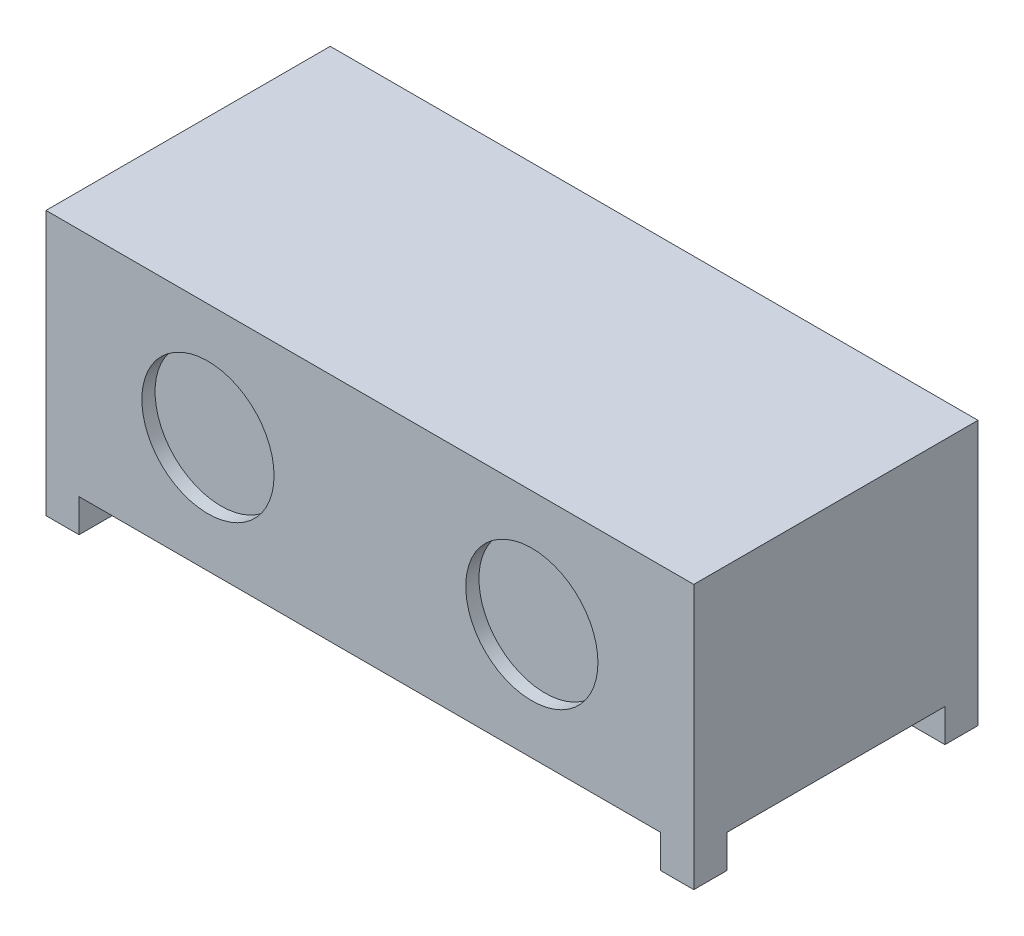
ISO-10303-21;
HEADER;
FILE_DESCRIPTION(('STEP AP214'),'2;1');
FILE_NAME('part.step','',(''),(''),'','','');
FILE_SCHEMA(('AUTOMOTIVE_DESIGN { 1 0 10303 214 1 1 1 1 }'));
ENDSEC;
DATA;
#1=APPLICATION_CONTEXT('core data for automotive mechanical design processes');
#2=APPLICATION_PROTOCOL_DEFINITION('international standard','automotive_design',2000,#1);
#3=PRODUCT_CONTEXT('',#1,'mechanical');
#4=PRODUCT('Part','Part','',(#3));
#5=PRODUCT_RELATED_PRODUCT_CATEGORY('part','',(#4));
#6=PRODUCT_DEFINITION_FORMATION('','',#4);
#7=PRODUCT_DEFINITION_CONTEXT('part definition',#1,'design');
#8=PRODUCT_DEFINITION('design','',#6,#7);
#9=PRODUCT_DEFINITION_SHAPE('','',#8);
#10=(LENGTH_UNIT() NAMED_UNIT(*) SI_UNIT(.MILLI.,.METRE.));
#11=(NAMED_UNIT(*) PLANE_ANGLE_UNIT() SI_UNIT($,.RADIAN.));
#12=(NAMED_UNIT(*) SI_UNIT($,.STERADIAN.) SOLID_ANGLE_UNIT());
#13=UNCERTAINTY_MEASURE_WITH_UNIT(LENGTH_MEASURE(1.E-05),#10,'distance_accuracy_value','');
#14=(GEOMETRIC_REPRESENTATION_CONTEXT(3) GLOBAL_UNCERTAINTY_ASSIGNED_CONTEXT((#13)) GLOBAL_UNIT_ASSIGNED_CONTEXT((#10,
#11,#12)) REPRESENTATION_CONTEXT('',''));
#15=CARTESIAN_POINT('',(0.,0.,0.));
#16=DIRECTION('',(0.,0.,1.));
#17=DIRECTION('',(1.,0.,0.));
#18=AXIS2_PLACEMENT_3D('',#15,#16,#17);
#19=CARTESIAN_POINT('',(0.,0.,0.));
#20=DIRECTION('',(0.,1.,0.));
#21=DIRECTION('',(0.,0.,1.));
#22=AXIS2_PLACEMENT_3D('',#19,#20,#21);
#23=PLANE('',#22);
#24=DIRECTION('',(-1.,0.,0.));
#25=VECTOR('',#24,1.);
#26=CARTESIAN_POINT('',(1244.6,0.,-419.1));
#27=LINE('',#26,#25);
#28=CARTESIAN_POINT('',(1244.6,0.,-419.1));
#29=VERTEX_POINT('',#28);
#30=CARTESIAN_POINT('',(1117.6,0.,-419.1));
#31=VERTEX_POINT('',#30);
#32=EDGE_CURVE('E323',#29,#31,#27,.T.);
#33=ORIENTED_EDGE('',*,*,#32,.F.);
#34=DIRECTION('',(0.,0.,-1.));
#35=VECTOR('',#34,1.);
#36=CARTESIAN_POINT('',(1244.6,0.,-546.1));
#37=LINE('',#36,#35);
#38=CARTESIAN_POINT('',(1244.6,0.,419.1));
#39=VERTEX_POINT('',#38);
#40=EDGE_CURVE('E171',#39,#29,#37,.T.);
#41=ORIENTED_EDGE('',*,*,#40,.F.);
#42=DIRECTION('',(1.,0.,0.));
#43=VECTOR('',#42,1.);
#44=CARTESIAN_POINT('',(1244.6,0.,419.1));
#45=LINE('',#44,#43);
#46=CARTESIAN_POINT('',(1117.6,0.,419.1));
#47=VERTEX_POINT('',#46);
#48=EDGE_CURVE('E174',#47,#39,#45,.T.);
#49=ORIENTED_EDGE('',*,*,#48,.F.);
#50=DIRECTION('',(0.,0.,-1.));
#51=VECTOR('',#50,1.);
#52=CARTESIAN_POINT('',(1117.6,0.,546.1));
#53=LINE('',#52,#51);
#54=CARTESIAN_POINT('',(1117.6,0.,546.1));
#55=VERTEX_POINT('',#54);
#56=EDGE_CURVE('E172',#55,#47,#53,.T.);
#57=ORIENTED_EDGE('',*,*,#56,.F.);
#58=DIRECTION('',(1.,0.,0.));
#59=VECTOR('',#58,1.);
#60=CARTESIAN_POINT('',(-1244.6,0.,546.1));
#61=LINE('',#60,#59);
#62=CARTESIAN_POINT('',(-1117.6,0.,546.1));
#63=VERTEX_POINT('',#62);
#64=EDGE_CURVE('E257',#63,#55,#61,.T.);
#65=ORIENTED_EDGE('',*,*,#64,.F.);
#66=DIRECTION('',(0.,0.,1.));
#67=VECTOR('',#66,1.);
#68=CARTESIAN_POINT('',(-1117.6,0.,546.1));
#69=LINE('',#68,#67);
#70=CARTESIAN_POINT('',(-1117.6,0.,419.1));
#71=VERTEX_POINT('',#70);
#72=EDGE_CURVE('E221',#71,#63,#69,.T.);
#73=ORIENTED_EDGE('',*,*,#72,.F.);
#74=DIRECTION('',(1.,0.,0.));
#75=VECTOR('',#74,1.);
#76=CARTESIAN_POINT('',(-1244.6,0.,419.1));
#77=LINE('',#76,#75);
#78=CARTESIAN_POINT('',(-1244.6,0.,419.1));
#79=VERTEX_POINT('',#78);
#80=EDGE_CURVE('E216',#79,#71,#77,.T.);
#81=ORIENTED_EDGE('',*,*,#80,.F.);
#82=DIRECTION('',(0.,0.,1.));
#83=VECTOR('',#82,1.);
#84=CARTESIAN_POINT('',(-1244.6,0.,-546.1));
#85=LINE('',#84,#83);
#86=CARTESIAN_POINT('',(-1244.6,0.,-419.1));
#87=VERTEX_POINT('',#86);
#88=EDGE_CURVE('E267',#87,#79,#85,.T.);
#89=ORIENTED_EDGE('',*,*,#88,.F.);
#90=DIRECTION('',(-1.,0.,0.));
#91=VECTOR('',#90,1.);
#92=CARTESIAN_POINT('',(-1244.6,0.,-419.1));
#93=LINE('',#92,#91);
#94=CARTESIAN_POINT('',(-1117.6,0.,-419.1));
#95=VERTEX_POINT('',#94);
#96=EDGE_CURVE('E201',#95,#87,#93,.T.);
#97=ORIENTED_EDGE('',*,*,#96,.F.);
#98=DIRECTION('',(0.,0.,1.));
#99=VECTOR('',#98,1.);
#100=CARTESIAN_POINT('',(-1117.6,0.,-546.1));
#101=LINE('',#100,#99);
#102=CARTESIAN_POINT('',(-1117.6,0.,-546.1));
#103=VERTEX_POINT('',#102);
#104=EDGE_CURVE('E196',#103,#95,#101,.T.);
#105=ORIENTED_EDGE('',*,*,#104,.F.);
#106=DIRECTION('',(-1.,0.,0.));
#107=VECTOR('',#106,1.);
#108=CARTESIAN_POINT('',(-1244.6,0.,-546.1));
#109=LINE('',#108,#107);
#110=CARTESIAN_POINT('',(1117.6,0.,-546.1));
#111=VERTEX_POINT('',#110);
#112=EDGE_CURVE('E265',#111,#103,#109,.T.);
#113=ORIENTED_EDGE('',*,*,#112,.F.);
#114=DIRECTION('',(0.,0.,-1.));
#115=VECTOR('',#114,1.);
#116=CARTESIAN_POINT('',(1117.6,0.,-546.1));
#117=LINE('',#116,#115);
#118=EDGE_CURVE('E166',#31,#111,#117,.T.);
#119=ORIENTED_EDGE('',*,*,#118,.F.);
#120=EDGE_LOOP('',(#33,#41,#49,#57,#65,#73,#81,#89,#97,#105,#113,#119));
#121=FACE_BOUND('',#120,.T.);
#122=ADVANCED_FACE('F34',(#121),#23,.F.);
#123=CARTESIAN_POINT('',(1244.6,889.,-546.1));
#124=DIRECTION('',(-1.,0.,0.));
#125=DIRECTION('',(0.,0.,1.));
#126=AXIS2_PLACEMENT_3D('',#123,#124,#125);
#127=PLANE('',#126);
#128=DIRECTION('',(0.,-1.,0.));
#129=VECTOR('',#128,1.);
#130=CARTESIAN_POINT('',(1244.6,889.,546.1));
#131=LINE('',#130,#129);
#132=CARTESIAN_POINT('',(1244.6,889.,546.1));
#133=VERTEX_POINT('',#132);
#134=CARTESIAN_POINT('',(1244.6,-127.,546.1));
#135=VERTEX_POINT('',#134);
#136=EDGE_CURVE('E263',#133,#135,#131,.T.);
#137=ORIENTED_EDGE('',*,*,#136,.T.);
#138=DIRECTION('',(0.,0.,1.));
#139=VECTOR('',#138,1.);
#140=CARTESIAN_POINT('',(1244.6,-127.,546.1));
#141=LINE('',#140,#139);
#142=CARTESIAN_POINT('',(1244.6,-127.,419.1));
#143=VERTEX_POINT('',#142);
#144=EDGE_CURVE('E179',#143,#135,#141,.T.);
#145=ORIENTED_EDGE('',*,*,#144,.F.);
#146=DIRECTION('',(0.,1.,0.));
#147=VECTOR('',#146,1.);
#148=CARTESIAN_POINT('',(1244.6,-127.,419.1));
#149=LINE('',#148,#147);
#150=EDGE_CURVE('E187',#143,#39,#149,.T.);
#151=ORIENTED_EDGE('',*,*,#150,.T.);
#152=ORIENTED_EDGE('',*,*,#40,.T.);
#153=DIRECTION('',(0.,1.,0.));
#154=VECTOR('',#153,1.);
#155=CARTESIAN_POINT('',(1244.6,-127.,-419.1));
#156=LINE('',#155,#154);
#157=CARTESIAN_POINT('',(1244.6,-127.,-419.1));
#158=VERTEX_POINT('',#157);
#159=EDGE_CURVE('E151',#158,#29,#156,.T.);
#160=ORIENTED_EDGE('',*,*,#159,.F.);
#161=DIRECTION('',(0.,0.,1.));
#162=VECTOR('',#161,1.);
#163=CARTESIAN_POINT('',(1244.6,-127.,-546.1));
#164=LINE('',#163,#162);
#165=CARTESIAN_POINT('',(1244.6,-127.,-546.1));
#166=VERTEX_POINT('',#165);
#167=EDGE_CURVE('E158',#166,#158,#164,.T.);
#168=ORIENTED_EDGE('',*,*,#167,.F.);
#169=DIRECTION('',(0.,-1.,0.));
#170=VECTOR('',#169,1.);
#171=CARTESIAN_POINT('',(1244.6,889.,-546.1));
#172=LINE('',#171,#170);
#173=CARTESIAN_POINT('',(1244.6,889.,-546.1));
#174=VERTEX_POINT('',#173);
#175=EDGE_CURVE('E11',#174,#166,#172,.T.);
#176=ORIENTED_EDGE('',*,*,#175,.F.);
#177=DIRECTION('',(0.,0.,-1.));
#178=VECTOR('',#177,1.);
#179=CARTESIAN_POINT('',(1244.6,889.,-546.1));
#180=LINE('',#179,#178);
#181=EDGE_CURVE('E253',#133,#174,#180,.T.);
#182=ORIENTED_EDGE('',*,*,#181,.F.);
#183=EDGE_LOOP('',(#137,#145,#151,#152,#160,#168,#176,#182));
#184=FACE_BOUND('',#183,.T.);
#185=ADVANCED_FACE('F36',(#184),#127,.F.);
#186=CARTESIAN_POINT('',(-1244.6,889.,-546.1));
#187=DIRECTION('',(0.,0.,1.));
#188=DIRECTION('',(1.,0.,0.));
#189=AXIS2_PLACEMENT_3D('',#186,#187,#188);
#190=PLANE('',#189);
#191=ORIENTED_EDGE('',*,*,#175,.T.);
#192=DIRECTION('',(1.,0.,0.));
#193=VECTOR('',#192,1.);
#194=CARTESIAN_POINT('',(1244.6,-127.,-546.1));
#195=LINE('',#194,#193);
#196=CARTESIAN_POINT('',(1117.6,-127.,-546.1));
#197=VERTEX_POINT('',#196);
#198=EDGE_CURVE('E163',#197,#166,#195,.T.);
#199=ORIENTED_EDGE('',*,*,#198,.F.);
#200=DIRECTION('',(0.,1.,0.));
#201=VECTOR('',#200,1.);
#202=CARTESIAN_POINT('',(1117.6,-127.,-546.1));
#203=LINE('',#202,#201);
#204=EDGE_CURVE('E49',#197,#111,#203,.T.);
#205=ORIENTED_EDGE('',*,*,#204,.T.);
#206=ORIENTED_EDGE('',*,*,#112,.T.);
#207=DIRECTION('',(0.,1.,0.));
#208=VECTOR('',#207,1.);
#209=CARTESIAN_POINT('',(-1117.6,-127.,-546.1));
#210=LINE('',#209,#208);
#211=CARTESIAN_POINT('',(-1117.6,-127.,-546.1));
#212=VERTEX_POINT('',#211);
#213=EDGE_CURVE('E213',#212,#103,#210,.T.);
#214=ORIENTED_EDGE('',*,*,#213,.F.);
#215=DIRECTION('',(1.,0.,0.));
#216=VECTOR('',#215,1.);
#217=CARTESIAN_POINT('',(-1244.6,-127.,-546.1));
#218=LINE('',#217,#216);
#219=CARTESIAN_POINT('',(-1244.6,-127.,-546.1));
#220=VERTEX_POINT('',#219);
#221=EDGE_CURVE('E200',#220,#212,#218,.T.);
#222=ORIENTED_EDGE('',*,*,#221,.F.);
#223=DIRECTION('',(0.,-1.,0.));
#224=VECTOR('',#223,1.);
#225=CARTESIAN_POINT('',(-1244.6,889.,-546.1));
#226=LINE('',#225,#224);
#227=CARTESIAN_POINT('',(-1244.6,889.,-546.1));
#228=VERTEX_POINT('',#227);
#229=EDGE_CURVE('E42',#228,#220,#226,.T.);
#230=ORIENTED_EDGE('',*,*,#229,.F.);
#231=DIRECTION('',(-1.,0.,0.));
#232=VECTOR('',#231,1.);
#233=CARTESIAN_POINT('',(-1244.6,889.,-546.1));
#234=LINE('',#233,#232);
#235=EDGE_CURVE('E256',#174,#228,#234,.T.);
#236=ORIENTED_EDGE('',*,*,#235,.F.);
#237=EDGE_LOOP('',(#191,#199,#205,#206,#214,#222,#230,#236));
#238=FACE_BOUND('',#237,.T.);
#239=ADVANCED_FACE('F279',(#238),#190,.F.);
#240=CARTESIAN_POINT('',(-1244.6,889.,-546.1));
#241=DIRECTION('',(1.,0.,0.));
#242=DIRECTION('',(0.,0.,-1.));
#243=AXIS2_PLACEMENT_3D('',#240,#241,#242);
#244=PLANE('',#243);
#245=ORIENTED_EDGE('',*,*,#229,.T.);
#246=DIRECTION('',(0.,0.,-1.));
#247=VECTOR('',#246,1.);
#248=CARTESIAN_POINT('',(-1244.6,-127.,-546.1));
#249=LINE('',#248,#247);
#250=CARTESIAN_POINT('',(-1244.6,-127.,-419.1));
#251=VERTEX_POINT('',#250);
#252=EDGE_CURVE('E197',#251,#220,#249,.T.);
#253=ORIENTED_EDGE('',*,*,#252,.F.);
#254=DIRECTION('',(0.,1.,0.));
#255=VECTOR('',#254,1.);
#256=CARTESIAN_POINT('',(-1244.6,-127.,-419.1));
#257=LINE('',#256,#255);
#258=EDGE_CURVE('E57',#251,#87,#257,.T.);
#259=ORIENTED_EDGE('',*,*,#258,.T.);
#260=ORIENTED_EDGE('',*,*,#88,.T.);
#261=DIRECTION('',(0.,1.,0.));
#262=VECTOR('',#261,1.);
#263=CARTESIAN_POINT('',(-1244.6,-127.,419.1));
#264=LINE('',#263,#262);
#265=CARTESIAN_POINT('',(-1244.6,-127.,419.1));
#266=VERTEX_POINT('',#265);
#267=EDGE_CURVE('E238',#266,#79,#264,.T.);
#268=ORIENTED_EDGE('',*,*,#267,.F.);
#269=DIRECTION('',(0.,0.,-1.));
#270=VECTOR('',#269,1.);
#271=CARTESIAN_POINT('',(-1244.6,-127.,546.1));
#272=LINE('',#271,#270);
#273=CARTESIAN_POINT('',(-1244.6,-127.,546.1));
#274=VERTEX_POINT('',#273);
#275=EDGE_CURVE('E217',#274,#266,#272,.T.);
#276=ORIENTED_EDGE('',*,*,#275,.F.);
#277=DIRECTION('',(0.,-1.,0.));
#278=VECTOR('',#277,1.);
#279=CARTESIAN_POINT('',(-1244.6,889.,546.1));
#280=LINE('',#279,#278);
#281=CARTESIAN_POINT('',(-1244.6,889.,546.1));
#282=VERTEX_POINT('',#281);
#283=EDGE_CURVE('E272',#282,#274,#280,.T.);
#284=ORIENTED_EDGE('',*,*,#283,.F.);
#285=DIRECTION('',(0.,0.,1.));
#286=VECTOR('',#285,1.);
#287=CARTESIAN_POINT('',(-1244.6,889.,-546.1));
#288=LINE('',#287,#286);
#289=EDGE_CURVE('E259',#228,#282,#288,.T.);
#290=ORIENTED_EDGE('',*,*,#289,.F.);
#291=EDGE_LOOP('',(#245,#253,#259,#260,#268,#276,#284,#290));
#292=FACE_BOUND('',#291,.T.);
#293=ADVANCED_FACE('F276',(#292),#244,.F.);
#294=CARTESIAN_POINT('',(-1244.6,889.,546.1));
#295=DIRECTION('',(0.,0.,-1.));
#296=DIRECTION('',(-1.,0.,0.));
#297=AXIS2_PLACEMENT_3D('',#294,#295,#296);
#298=PLANE('',#297);
#299=CARTESIAN_POINT('',(622.3,444.5,546.1));
#300=DIRECTION('',(0.,0.,1.));
#301=DIRECTION('',(1.,0.,0.));
#302=AXIS2_PLACEMENT_3D('',#299,#300,#301);
#303=CIRCLE('',#302,254.);
#304=CARTESIAN_POINT('',(876.3,444.5,546.1));
#305=VERTEX_POINT('',#304);
#306=EDGE_CURVE('E245',#305,#305,#303,.T.);
#307=ORIENTED_EDGE('',*,*,#306,.F.);
#308=EDGE_LOOP('',(#307));
#309=FACE_BOUND('',#308,.T.);
#310=CARTESIAN_POINT('',(-622.3,444.5,546.1));
#311=DIRECTION('',(0.,0.,1.));
#312=DIRECTION('',(1.,0.,0.));
#313=AXIS2_PLACEMENT_3D('',#310,#311,#312);
#314=CIRCLE('',#313,254.);
#315=CARTESIAN_POINT('',(-368.3,444.5,546.1));
#316=VERTEX_POINT('',#315);
#317=EDGE_CURVE('E241',#316,#316,#314,.T.);
#318=ORIENTED_EDGE('',*,*,#317,.F.);
#319=EDGE_LOOP('',(#318));
#320=FACE_BOUND('',#319,.T.);
#321=ORIENTED_EDGE('',*,*,#283,.T.);
#322=DIRECTION('',(-1.,0.,0.));
#323=VECTOR('',#322,1.);
#324=CARTESIAN_POINT('',(-1244.6,-127.,546.1));
#325=LINE('',#324,#323);
#326=CARTESIAN_POINT('',(-1117.6,-127.,546.1));
#327=VERTEX_POINT('',#326);
#328=EDGE_CURVE('E225',#327,#274,#325,.T.);
#329=ORIENTED_EDGE('',*,*,#328,.F.);
#330=DIRECTION('',(0.,1.,0.));
#331=VECTOR('',#330,1.);
#332=CARTESIAN_POINT('',(-1117.6,-127.,546.1));
#333=LINE('',#332,#331);
#334=EDGE_CURVE('E228',#327,#63,#333,.T.);
#335=ORIENTED_EDGE('',*,*,#334,.T.);
#336=ORIENTED_EDGE('',*,*,#64,.T.);
#337=DIRECTION('',(0.,1.,0.));
#338=VECTOR('',#337,1.);
#339=CARTESIAN_POINT('',(1117.6,-127.,546.1));
#340=LINE('',#339,#338);
#341=CARTESIAN_POINT('',(1117.6,-127.,546.1));
#342=VERTEX_POINT('',#341);
#343=EDGE_CURVE('E194',#342,#55,#340,.T.);
#344=ORIENTED_EDGE('',*,*,#343,.F.);
#345=DIRECTION('',(-1.,0.,0.));
#346=VECTOR('',#345,1.);
#347=CARTESIAN_POINT('',(1244.6,-127.,546.1));
#348=LINE('',#347,#346);
#349=EDGE_CURVE('E182',#135,#342,#348,.T.);
#350=ORIENTED_EDGE('',*,*,#349,.F.);
#351=ORIENTED_EDGE('',*,*,#136,.F.);
#352=DIRECTION('',(1.,0.,0.));
#353=VECTOR('',#352,1.);
#354=CARTESIAN_POINT('',(-1244.6,889.,546.1));
#355=LINE('',#354,#353);
#356=EDGE_CURVE('E261',#282,#133,#355,.T.);
#357=ORIENTED_EDGE('',*,*,#356,.F.);
#358=EDGE_LOOP('',(#321,#329,#335,#336,#344,#350,#351,#357));
#359=FACE_BOUND('',#358,.T.);
#360=ADVANCED_FACE('F303',(#309,#320,#359),#298,.F.);
#361=CARTESIAN_POINT('',(0.,889.,0.));
#362=DIRECTION('',(0.,1.,0.));
#363=DIRECTION('',(0.,0.,1.));
#364=AXIS2_PLACEMENT_3D('',#361,#362,#363);
#365=PLANE('',#364);
#366=ORIENTED_EDGE('',*,*,#181,.T.);
#367=ORIENTED_EDGE('',*,*,#235,.T.);
#368=ORIENTED_EDGE('',*,*,#289,.T.);
#369=ORIENTED_EDGE('',*,*,#356,.T.);
#370=EDGE_LOOP('',(#366,#367,#368,#369));
#371=FACE_BOUND('',#370,.T.);
#372=ADVANCED_FACE('F309',(#371),#365,.T.);
#373=CARTESIAN_POINT('',(-622.3,444.5,495.3));
#374=DIRECTION('',(0.,0.,1.));
#375=DIRECTION('',(1.,0.,0.));
#376=AXIS2_PLACEMENT_3D('',#373,#374,#375);
#377=CYLINDRICAL_SURFACE('',#376,254.);
#378=CARTESIAN_POINT('',(-622.3,444.5,495.3));
#379=DIRECTION('',(0.,0.,1.));
#380=DIRECTION('',(1.,0.,0.));
#381=AXIS2_PLACEMENT_3D('',#378,#379,#380);
#382=CIRCLE('',#381,254.);
#383=CARTESIAN_POINT('',(-368.3,444.5,495.3));
#384=VERTEX_POINT('',#383);
#385=EDGE_CURVE('E248',#384,#384,#382,.T.);
#386=ORIENTED_EDGE('',*,*,#385,.F.);
#387=EDGE_LOOP('',(#386));
#388=FACE_BOUND('',#387,.T.);
#389=ORIENTED_EDGE('',*,*,#317,.T.);
#390=EDGE_LOOP('',(#389));
#391=FACE_BOUND('',#390,.T.);
#392=ADVANCED_FACE('F374',(#388,#391),#377,.F.);
#393=CARTESIAN_POINT('',(-622.3,444.5,495.3));
#394=DIRECTION('',(0.,0.,1.));
#395=DIRECTION('',(1.,0.,0.));
#396=AXIS2_PLACEMENT_3D('',#393,#394,#395);
#397=PLANE('',#396);
#398=ORIENTED_EDGE('',*,*,#385,.T.);
#399=EDGE_LOOP('',(#398));
#400=FACE_BOUND('',#399,.T.);
#401=ADVANCED_FACE('F380',(#400),#397,.T.);
#402=CARTESIAN_POINT('',(622.3,444.5,495.3));
#403=DIRECTION('',(0.,0.,1.));
#404=DIRECTION('',(1.,0.,0.));
#405=AXIS2_PLACEMENT_3D('',#402,#403,#404);
#406=CYLINDRICAL_SURFACE('',#405,254.);
#407=CARTESIAN_POINT('',(622.3,444.5,495.3));
#408=DIRECTION('',(0.,0.,1.));
#409=DIRECTION('',(1.,0.,0.));
#410=AXIS2_PLACEMENT_3D('',#407,#408,#409);
#411=CIRCLE('',#410,254.);
#412=CARTESIAN_POINT('',(876.3,444.5,495.3));
#413=VERTEX_POINT('',#412);
#414=EDGE_CURVE('E242',#413,#413,#411,.T.);
#415=ORIENTED_EDGE('',*,*,#414,.F.);
#416=EDGE_LOOP('',(#415));
#417=FACE_BOUND('',#416,.T.);
#418=ORIENTED_EDGE('',*,*,#306,.T.);
#419=EDGE_LOOP('',(#418));
#420=FACE_BOUND('',#419,.T.);
#421=ADVANCED_FACE('F387',(#417,#420),#406,.F.);
#422=CARTESIAN_POINT('',(622.3,444.5,495.3));
#423=DIRECTION('',(0.,0.,1.));
#424=DIRECTION('',(1.,0.,0.));
#425=AXIS2_PLACEMENT_3D('',#422,#423,#424);
#426=PLANE('',#425);
#427=ORIENTED_EDGE('',*,*,#414,.T.);
#428=EDGE_LOOP('',(#427));
#429=FACE_BOUND('',#428,.T.);
#430=ADVANCED_FACE('F395',(#429),#426,.T.);
#431=CARTESIAN_POINT('',(-1244.6,-127.,419.1));
#432=DIRECTION('',(0.,0.,1.));
#433=DIRECTION('',(1.,0.,0.));
#434=AXIS2_PLACEMENT_3D('',#431,#432,#433);
#435=PLANE('',#434);
#436=ORIENTED_EDGE('',*,*,#80,.T.);
#437=DIRECTION('',(0.,1.,0.));
#438=VECTOR('',#437,1.);
#439=CARTESIAN_POINT('',(-1117.6,-127.,419.1));
#440=LINE('',#439,#438);
#441=CARTESIAN_POINT('',(-1117.6,-127.,419.1));
#442=VERTEX_POINT('',#441);
#443=EDGE_CURVE('E235',#442,#71,#440,.T.);
#444=ORIENTED_EDGE('',*,*,#443,.F.);
#445=DIRECTION('',(1.,0.,0.));
#446=VECTOR('',#445,1.);
#447=CARTESIAN_POINT('',(-1244.6,-127.,419.1));
#448=LINE('',#447,#446);
#449=EDGE_CURVE('E220',#266,#442,#448,.T.);
#450=ORIENTED_EDGE('',*,*,#449,.F.);
#451=ORIENTED_EDGE('',*,*,#267,.T.);
#452=EDGE_LOOP('',(#436,#444,#450,#451));
#453=FACE_BOUND('',#452,.T.);
#454=ADVANCED_FACE('F295',(#453),#435,.F.);
#455=CARTESIAN_POINT('',(-1117.6,-127.,546.1));
#456=DIRECTION('',(-1.,0.,0.));
#457=DIRECTION('',(0.,0.,1.));
#458=AXIS2_PLACEMENT_3D('',#455,#456,#457);
#459=PLANE('',#458);
#460=ORIENTED_EDGE('',*,*,#72,.T.);
#461=ORIENTED_EDGE('',*,*,#334,.F.);
#462=DIRECTION('',(0.,0.,1.));
#463=VECTOR('',#462,1.);
#464=CARTESIAN_POINT('',(-1117.6,-127.,546.1));
#465=LINE('',#464,#463);
#466=EDGE_CURVE('E223',#442,#327,#465,.T.);
#467=ORIENTED_EDGE('',*,*,#466,.F.);
#468=ORIENTED_EDGE('',*,*,#443,.T.);
#469=EDGE_LOOP('',(#460,#461,#467,#468));
#470=FACE_BOUND('',#469,.T.);
#471=ADVANCED_FACE('F340',(#470),#459,.F.);
#472=CARTESIAN_POINT('',(0.,-127.,0.));
#473=DIRECTION('',(0.,-1.,0.));
#474=DIRECTION('',(0.,0.,-1.));
#475=AXIS2_PLACEMENT_3D('',#472,#473,#474);
#476=PLANE('',#475);
#477=ORIENTED_EDGE('',*,*,#275,.T.);
#478=ORIENTED_EDGE('',*,*,#449,.T.);
#479=ORIENTED_EDGE('',*,*,#466,.T.);
#480=ORIENTED_EDGE('',*,*,#328,.T.);
#481=EDGE_LOOP('',(#477,#478,#479,#480));
#482=FACE_BOUND('',#481,.T.);
#483=ADVANCED_FACE('F299',(#482),#476,.T.);
#484=CARTESIAN_POINT('',(-1117.6,-127.,-546.1));
#485=DIRECTION('',(-1.,0.,0.));
#486=DIRECTION('',(0.,0.,1.));
#487=AXIS2_PLACEMENT_3D('',#484,#485,#486);
#488=PLANE('',#487);
#489=ORIENTED_EDGE('',*,*,#104,.T.);
#490=DIRECTION('',(0.,1.,0.));
#491=VECTOR('',#490,1.);
#492=CARTESIAN_POINT('',(-1117.6,-127.,-419.1));
#493=LINE('',#492,#491);
#494=CARTESIAN_POINT('',(-1117.6,-127.,-419.1));
#495=VERTEX_POINT('',#494);
#496=EDGE_CURVE('E210',#495,#95,#493,.T.);
#497=ORIENTED_EDGE('',*,*,#496,.F.);
#498=DIRECTION('',(0.,0.,1.));
#499=VECTOR('',#498,1.);
#500=CARTESIAN_POINT('',(-1117.6,-127.,-546.1));
#501=LINE('',#500,#499);
#502=EDGE_CURVE('E203',#212,#495,#501,.T.);
#503=ORIENTED_EDGE('',*,*,#502,.F.);
#504=ORIENTED_EDGE('',*,*,#213,.T.);
#505=EDGE_LOOP('',(#489,#497,#503,#504));
#506=FACE_BOUND('',#505,.T.);
#507=ADVANCED_FACE('F332',(#506),#488,.F.);
#508=CARTESIAN_POINT('',(-1244.6,-127.,-419.1));
#509=DIRECTION('',(0.,0.,-1.));
#510=DIRECTION('',(-1.,0.,0.));
#511=AXIS2_PLACEMENT_3D('',#508,#509,#510);
#512=PLANE('',#511);
#513=ORIENTED_EDGE('',*,*,#96,.T.);
#514=ORIENTED_EDGE('',*,*,#258,.F.);
#515=DIRECTION('',(-1.,0.,0.));
#516=VECTOR('',#515,1.);
#517=CARTESIAN_POINT('',(-1244.6,-127.,-419.1));
#518=LINE('',#517,#516);
#519=EDGE_CURVE('E205',#495,#251,#518,.T.);
#520=ORIENTED_EDGE('',*,*,#519,.F.);
#521=ORIENTED_EDGE('',*,*,#496,.T.);
#522=EDGE_LOOP('',(#513,#514,#520,#521));
#523=FACE_BOUND('',#522,.T.);
#524=ADVANCED_FACE('F286',(#523),#512,.F.);
#525=CARTESIAN_POINT('',(0.,-127.,0.));
#526=DIRECTION('',(0.,1.,0.));
#527=DIRECTION('',(0.,0.,1.));
#528=AXIS2_PLACEMENT_3D('',#525,#526,#527);
#529=PLANE('',#528);
#530=ORIENTED_EDGE('',*,*,#252,.T.);
#531=ORIENTED_EDGE('',*,*,#221,.T.);
#532=ORIENTED_EDGE('',*,*,#502,.T.);
#533=ORIENTED_EDGE('',*,*,#519,.T.);
#534=EDGE_LOOP('',(#530,#531,#532,#533));
#535=FACE_BOUND('',#534,.T.);
#536=ADVANCED_FACE('F282',(#535),#529,.F.);
#537=CARTESIAN_POINT('',(1117.6,-127.,546.1));
#538=DIRECTION('',(1.,0.,0.));
#539=DIRECTION('',(0.,0.,-1.));
#540=AXIS2_PLACEMENT_3D('',#537,#538,#539);
#541=PLANE('',#540);
#542=ORIENTED_EDGE('',*,*,#56,.T.);
#543=DIRECTION('',(0.,1.,0.));
#544=VECTOR('',#543,1.);
#545=CARTESIAN_POINT('',(1117.6,-127.,419.1));
#546=LINE('',#545,#544);
#547=CARTESIAN_POINT('',(1117.6,-127.,419.1));
#548=VERTEX_POINT('',#547);
#549=EDGE_CURVE('E191',#548,#47,#546,.T.);
#550=ORIENTED_EDGE('',*,*,#549,.F.);
#551=DIRECTION('',(0.,0.,-1.));
#552=VECTOR('',#551,1.);
#553=CARTESIAN_POINT('',(1117.6,-127.,546.1));
#554=LINE('',#553,#552);
#555=EDGE_CURVE('E184',#342,#548,#554,.T.);
#556=ORIENTED_EDGE('',*,*,#555,.F.);
#557=ORIENTED_EDGE('',*,*,#343,.T.);
#558=EDGE_LOOP('',(#542,#550,#556,#557));
#559=FACE_BOUND('',#558,.T.);
#560=ADVANCED_FACE('F439',(#559),#541,.F.);
#561=CARTESIAN_POINT('',(1244.6,-127.,419.1));
#562=DIRECTION('',(0.,0.,1.));
#563=DIRECTION('',(1.,0.,0.));
#564=AXIS2_PLACEMENT_3D('',#561,#562,#563);
#565=PLANE('',#564);
#566=ORIENTED_EDGE('',*,*,#48,.T.);
#567=ORIENTED_EDGE('',*,*,#150,.F.);
#568=DIRECTION('',(1.,0.,0.));
#569=VECTOR('',#568,1.);
#570=CARTESIAN_POINT('',(1244.6,-127.,419.1));
#571=LINE('',#570,#569);
#572=EDGE_CURVE('E186',#548,#143,#571,.T.);
#573=ORIENTED_EDGE('',*,*,#572,.F.);
#574=ORIENTED_EDGE('',*,*,#549,.T.);
#575=EDGE_LOOP('',(#566,#567,#573,#574));
#576=FACE_BOUND('',#575,.T.);
#577=ADVANCED_FACE('F319',(#576),#565,.F.);
#578=CARTESIAN_POINT('',(0.,-127.,0.));
#579=DIRECTION('',(0.,1.,0.));
#580=DIRECTION('',(0.,0.,1.));
#581=AXIS2_PLACEMENT_3D('',#578,#579,#580);
#582=PLANE('',#581);
#583=ORIENTED_EDGE('',*,*,#144,.T.);
#584=ORIENTED_EDGE('',*,*,#349,.T.);
#585=ORIENTED_EDGE('',*,*,#555,.T.);
#586=ORIENTED_EDGE('',*,*,#572,.T.);
#587=EDGE_LOOP('',(#583,#584,#585,#586));
#588=FACE_BOUND('',#587,.T.);
#589=ADVANCED_FACE('F314',(#588),#582,.F.);
#590=CARTESIAN_POINT('',(1244.6,-127.,-419.1));
#591=DIRECTION('',(0.,0.,-1.));
#592=DIRECTION('',(-1.,0.,0.));
#593=AXIS2_PLACEMENT_3D('',#590,#591,#592);
#594=PLANE('',#593);
#595=ORIENTED_EDGE('',*,*,#32,.T.);
#596=DIRECTION('',(0.,1.,0.));
#597=VECTOR('',#596,1.);
#598=CARTESIAN_POINT('',(1117.6,-127.,-419.1));
#599=LINE('',#598,#597);
#600=CARTESIAN_POINT('',(1117.6,-127.,-419.1));
#601=VERTEX_POINT('',#600);
#602=EDGE_CURVE('E154',#601,#31,#599,.T.);
#603=ORIENTED_EDGE('',*,*,#602,.F.);
#604=DIRECTION('',(-1.,0.,0.));
#605=VECTOR('',#604,1.);
#606=CARTESIAN_POINT('',(1244.6,-127.,-419.1));
#607=LINE('',#606,#605);
#608=EDGE_CURVE('E147',#158,#601,#607,.T.);
#609=ORIENTED_EDGE('',*,*,#608,.F.);
#610=ORIENTED_EDGE('',*,*,#159,.T.);
#611=EDGE_LOOP('',(#595,#603,#609,#610));
#612=FACE_BOUND('',#611,.T.);
#613=ADVANCED_FACE('F149',(#612),#594,.F.);
#614=CARTESIAN_POINT('',(1117.6,-127.,-546.1));
#615=DIRECTION('',(1.,0.,0.));
#616=DIRECTION('',(0.,0.,-1.));
#617=AXIS2_PLACEMENT_3D('',#614,#615,#616);
#618=PLANE('',#617);
#619=ORIENTED_EDGE('',*,*,#118,.T.);
#620=ORIENTED_EDGE('',*,*,#204,.F.);
#621=DIRECTION('',(0.,0.,-1.));
#622=VECTOR('',#621,1.);
#623=CARTESIAN_POINT('',(1117.6,-127.,-546.1));
#624=LINE('',#623,#622);
#625=EDGE_CURVE('E157',#601,#197,#624,.T.);
#626=ORIENTED_EDGE('',*,*,#625,.F.);
#627=ORIENTED_EDGE('',*,*,#602,.T.);
#628=EDGE_LOOP('',(#619,#620,#626,#627));
#629=FACE_BOUND('',#628,.T.);
#630=ADVANCED_FACE('F330',(#629),#618,.F.);
#631=CARTESIAN_POINT('',(0.,-127.,0.));
#632=DIRECTION('',(0.,-1.,0.));
#633=DIRECTION('',(0.,0.,-1.));
#634=AXIS2_PLACEMENT_3D('',#631,#632,#633);
#635=PLANE('',#634);
#636=ORIENTED_EDGE('',*,*,#167,.T.);
#637=ORIENTED_EDGE('',*,*,#608,.T.);
#638=ORIENTED_EDGE('',*,*,#625,.T.);
#639=ORIENTED_EDGE('',*,*,#198,.T.);
#640=EDGE_LOOP('',(#636,#637,#638,#639));
#641=FACE_BOUND('',#640,.T.);
#642=ADVANCED_FACE('F162',(#641),#635,.T.);
#643=CLOSED_SHELL('',(#122,#185,#239,#293,#360,#372,#392,#401,#421,#430,#454,#471,#483,#507,
#524,#536,#560,#577,#589,#613,#630,#642));
#644=MANIFOLD_SOLID_BREP('B2',#643);
#645=ADVANCED_BREP_SHAPE_REPRESENTATION('',(#18,#644),#14);
#646=SHAPE_DEFINITION_REPRESENTATION(#9,#645);
ENDSEC;
END-ISO-10303-21;
